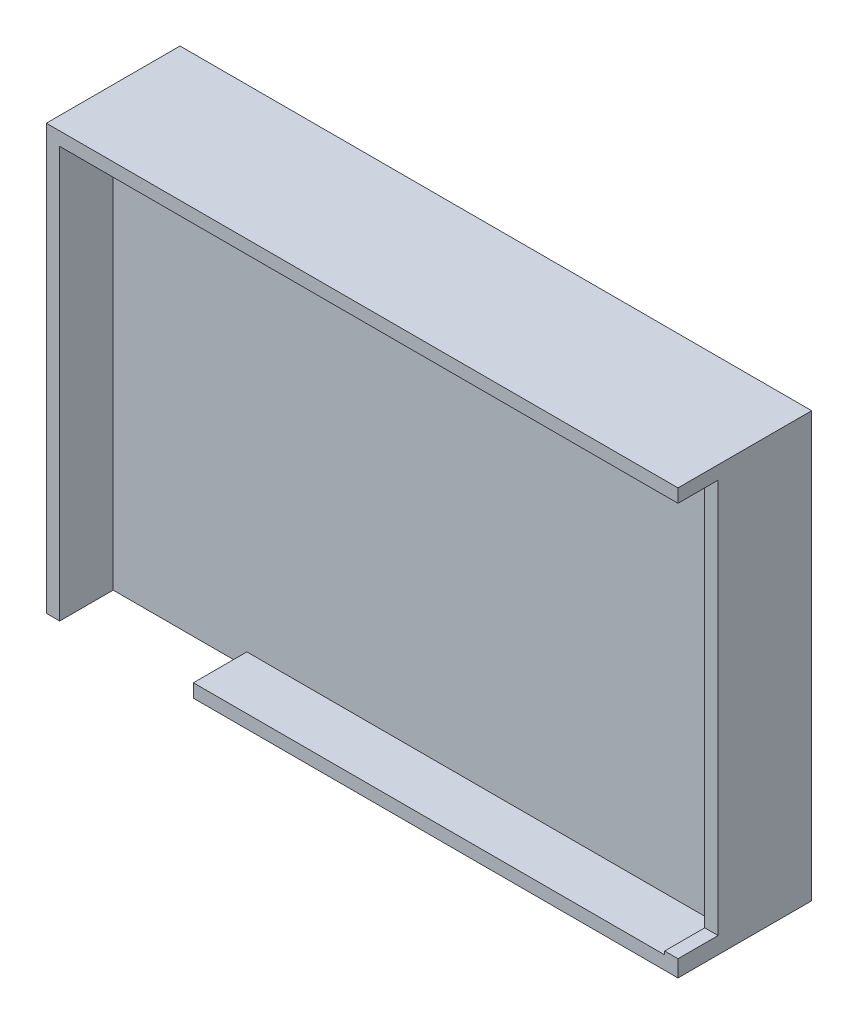
ISO-10303-21;
HEADER;
FILE_DESCRIPTION(('STEP AP214'),'2;1');
FILE_NAME('part.step','',(''),(''),'','','');
FILE_SCHEMA(('AUTOMOTIVE_DESIGN { 1 0 10303 214 1 1 1 1 }'));
ENDSEC;
DATA;
#1=APPLICATION_CONTEXT('core data for automotive mechanical design processes');
#2=APPLICATION_PROTOCOL_DEFINITION('international standard','automotive_design',2000,#1);
#3=PRODUCT_CONTEXT('',#1,'mechanical');
#4=PRODUCT('Part','Part','',(#3));
#5=PRODUCT_RELATED_PRODUCT_CATEGORY('part','',(#4));
#6=PRODUCT_DEFINITION_FORMATION('','',#4);
#7=PRODUCT_DEFINITION_CONTEXT('part definition',#1,'design');
#8=PRODUCT_DEFINITION('design','',#6,#7);
#9=PRODUCT_DEFINITION_SHAPE('','',#8);
#10=(LENGTH_UNIT() NAMED_UNIT(*) SI_UNIT(.MILLI.,.METRE.));
#11=(NAMED_UNIT(*) PLANE_ANGLE_UNIT() SI_UNIT($,.RADIAN.));
#12=(NAMED_UNIT(*) SI_UNIT($,.STERADIAN.) SOLID_ANGLE_UNIT());
#13=UNCERTAINTY_MEASURE_WITH_UNIT(LENGTH_MEASURE(1.E-05),#10,'distance_accuracy_value','');
#14=(GEOMETRIC_REPRESENTATION_CONTEXT(3) GLOBAL_UNCERTAINTY_ASSIGNED_CONTEXT((#13)) GLOBAL_UNIT_ASSIGNED_CONTEXT((#10,
#11,#12)) REPRESENTATION_CONTEXT('',''));
#15=CARTESIAN_POINT('',(0.,0.,0.));
#16=DIRECTION('',(0.,0.,1.));
#17=DIRECTION('',(1.,0.,0.));
#18=AXIS2_PLACEMENT_3D('',#15,#16,#17);
#19=CARTESIAN_POINT('',(0.,0.,10.));
#20=DIRECTION('',(0.,0.,1.));
#21=DIRECTION('',(1.,0.,0.));
#22=AXIS2_PLACEMENT_3D('',#19,#20,#21);
#23=PLANE('',#22);
#24=DIRECTION('',(-1.,0.,0.));
#25=VECTOR('',#24,1.);
#26=CARTESIAN_POINT('',(-45.25,29.75,10.));
#27=LINE('',#26,#25);
#28=CARTESIAN_POINT('',(47.25,29.75,10.));
#29=VERTEX_POINT('',#28);
#30=CARTESIAN_POINT('',(-45.25,29.75,10.));
#31=VERTEX_POINT('',#30);
#32=EDGE_CURVE('E287',#29,#31,#27,.T.);
#33=ORIENTED_EDGE('',*,*,#32,.F.);
#34=DIRECTION('',(0.,1.,0.));
#35=VECTOR('',#34,1.);
#36=CARTESIAN_POINT('',(47.25,-31.75,10.));
#37=LINE('',#36,#35);
#38=CARTESIAN_POINT('',(47.25,31.75,10.));
#39=VERTEX_POINT('',#38);
#40=EDGE_CURVE('E316',#29,#39,#37,.T.);
#41=ORIENTED_EDGE('',*,*,#40,.T.);
#42=DIRECTION('',(-1.,0.,0.));
#43=VECTOR('',#42,1.);
#44=CARTESIAN_POINT('',(47.25,31.75,10.));
#45=LINE('',#44,#43);
#46=CARTESIAN_POINT('',(-47.25,31.75,10.));
#47=VERTEX_POINT('',#46);
#48=EDGE_CURVE('E321',#39,#47,#45,.T.);
#49=ORIENTED_EDGE('',*,*,#48,.T.);
#50=DIRECTION('',(0.,-1.,0.));
#51=VECTOR('',#50,1.);
#52=CARTESIAN_POINT('',(-47.25,-31.75,10.));
#53=LINE('',#52,#51);
#54=CARTESIAN_POINT('',(-47.25,-31.75,10.));
#55=VERTEX_POINT('',#54);
#56=EDGE_CURVE('E307',#47,#55,#53,.T.);
#57=ORIENTED_EDGE('',*,*,#56,.T.);
#58=DIRECTION('',(1.,0.,0.));
#59=VECTOR('',#58,1.);
#60=CARTESIAN_POINT('',(47.25,-31.75,10.));
#61=LINE('',#60,#59);
#62=CARTESIAN_POINT('',(-45.25,-31.75,10.));
#63=VERTEX_POINT('',#62);
#64=EDGE_CURVE('E312',#55,#63,#61,.T.);
#65=ORIENTED_EDGE('',*,*,#64,.T.);
#66=DIRECTION('',(0.,-1.,0.));
#67=VECTOR('',#66,1.);
#68=CARTESIAN_POINT('',(-45.25,-29.75,10.));
#69=LINE('',#68,#67);
#70=EDGE_CURVE('E290',#31,#63,#69,.T.);
#71=ORIENTED_EDGE('',*,*,#70,.F.);
#72=EDGE_LOOP('',(#33,#41,#49,#57,#65,#71));
#73=FACE_BOUND('',#72,.T.);
#74=ADVANCED_FACE('F41',(#73),#23,.T.);
#75=CARTESIAN_POINT('',(45.25,-29.75,10.));
#76=DIRECTION('',(-1.,0.,0.));
#77=DIRECTION('',(0.,0.,1.));
#78=AXIS2_PLACEMENT_3D('',#75,#76,#77);
#79=PLANE('',#78);
#80=DIRECTION('',(0.,0.,1.));
#81=VECTOR('',#80,1.);
#82=CARTESIAN_POINT('',(45.25,-29.25,4.));
#83=LINE('',#82,#81);
#84=CARTESIAN_POINT('',(45.25,-29.25,4.));
#85=VERTEX_POINT('',#84);
#86=CARTESIAN_POINT('',(45.25,-29.25,10.));
#87=VERTEX_POINT('',#86);
#88=EDGE_CURVE('E161',#85,#87,#83,.T.);
#89=ORIENTED_EDGE('',*,*,#88,.F.);
#90=DIRECTION('',(0.,-1.,0.));
#91=VECTOR('',#90,1.);
#92=CARTESIAN_POINT('',(45.25,29.75,4.));
#93=LINE('',#92,#91);
#94=CARTESIAN_POINT('',(45.25,29.75,4.));
#95=VERTEX_POINT('',#94);
#96=EDGE_CURVE('E168',#95,#85,#93,.T.);
#97=ORIENTED_EDGE('',*,*,#96,.F.);
#98=DIRECTION('',(0.,0.,-1.));
#99=VECTOR('',#98,1.);
#100=CARTESIAN_POINT('',(45.25,29.75,10.));
#101=LINE('',#100,#99);
#102=CARTESIAN_POINT('',(45.25,29.75,2.));
#103=VERTEX_POINT('',#102);
#104=EDGE_CURVE('E304',#95,#103,#101,.T.);
#105=ORIENTED_EDGE('',*,*,#104,.T.);
#106=DIRECTION('',(0.,-1.,0.));
#107=VECTOR('',#106,1.);
#108=CARTESIAN_POINT('',(45.25,-29.75,2.));
#109=LINE('',#108,#107);
#110=CARTESIAN_POINT('',(45.25,-29.75,2.));
#111=VERTEX_POINT('',#110);
#112=EDGE_CURVE('E281',#103,#111,#109,.T.);
#113=ORIENTED_EDGE('',*,*,#112,.T.);
#114=DIRECTION('',(0.,0.,-1.));
#115=VECTOR('',#114,1.);
#116=CARTESIAN_POINT('',(45.25,-29.75,10.));
#117=LINE('',#116,#115);
#118=CARTESIAN_POINT('',(45.25,-29.75,10.));
#119=VERTEX_POINT('',#118);
#120=EDGE_CURVE('E296',#119,#111,#117,.T.);
#121=ORIENTED_EDGE('',*,*,#120,.F.);
#122=DIRECTION('',(0.,1.,0.));
#123=VECTOR('',#122,1.);
#124=CARTESIAN_POINT('',(45.25,-29.75,10.));
#125=LINE('',#124,#123);
#126=EDGE_CURVE('E183',#119,#87,#125,.T.);
#127=ORIENTED_EDGE('',*,*,#126,.T.);
#128=EDGE_LOOP('',(#89,#97,#105,#113,#121,#127));
#129=FACE_BOUND('',#128,.T.);
#130=ADVANCED_FACE('F180',(#129),#79,.T.);
#131=CARTESIAN_POINT('',(-45.25,29.75,10.));
#132=DIRECTION('',(0.,-1.,0.));
#133=DIRECTION('',(0.,0.,-1.));
#134=AXIS2_PLACEMENT_3D('',#131,#132,#133);
#135=PLANE('',#134);
#136=DIRECTION('',(0.,0.,-1.));
#137=VECTOR('',#136,1.);
#138=CARTESIAN_POINT('',(-45.25,29.75,10.));
#139=LINE('',#138,#137);
#140=CARTESIAN_POINT('',(-45.25,29.75,2.));
#141=VERTEX_POINT('',#140);
#142=EDGE_CURVE('E300',#31,#141,#139,.T.);
#143=ORIENTED_EDGE('',*,*,#142,.T.);
#144=DIRECTION('',(1.,0.,0.));
#145=VECTOR('',#144,1.);
#146=CARTESIAN_POINT('',(-45.25,29.75,2.));
#147=LINE('',#146,#145);
#148=EDGE_CURVE('E277',#141,#103,#147,.T.);
#149=ORIENTED_EDGE('',*,*,#148,.T.);
#150=ORIENTED_EDGE('',*,*,#104,.F.);
#151=DIRECTION('',(-1.,0.,0.));
#152=VECTOR('',#151,1.);
#153=CARTESIAN_POINT('',(45.25,29.75,4.));
#154=LINE('',#153,#152);
#155=CARTESIAN_POINT('',(47.25,29.75,4.));
#156=VERTEX_POINT('',#155);
#157=EDGE_CURVE('E173',#156,#95,#154,.T.);
#158=ORIENTED_EDGE('',*,*,#157,.F.);
#159=DIRECTION('',(0.,0.,1.));
#160=VECTOR('',#159,1.);
#161=CARTESIAN_POINT('',(47.25,29.75,4.));
#162=LINE('',#161,#160);
#163=EDGE_CURVE('E188',#156,#29,#162,.T.);
#164=ORIENTED_EDGE('',*,*,#163,.T.);
#165=ORIENTED_EDGE('',*,*,#32,.T.);
#166=EDGE_LOOP('',(#143,#149,#150,#158,#164,#165));
#167=FACE_BOUND('',#166,.T.);
#168=ADVANCED_FACE('F368',(#167),#135,.T.);
#169=CARTESIAN_POINT('',(-45.25,-29.75,10.));
#170=DIRECTION('',(1.,0.,0.));
#171=DIRECTION('',(0.,0.,-1.));
#172=AXIS2_PLACEMENT_3D('',#169,#170,#171);
#173=PLANE('',#172);
#174=ORIENTED_EDGE('',*,*,#70,.T.);
#175=DIRECTION('',(0.,0.,1.));
#176=VECTOR('',#175,1.);
#177=CARTESIAN_POINT('',(-45.25,-31.75,-18.0997512422418));
#178=LINE('',#177,#176);
#179=CARTESIAN_POINT('',(-45.25,-31.75,2.));
#180=VERTEX_POINT('',#179);
#181=EDGE_CURVE('E206',#180,#63,#178,.T.);
#182=ORIENTED_EDGE('',*,*,#181,.F.);
#183=DIRECTION('',(0.,1.,0.));
#184=VECTOR('',#183,1.);
#185=CARTESIAN_POINT('',(-45.25,-29.75,2.));
#186=LINE('',#185,#184);
#187=EDGE_CURVE('E273',#180,#141,#186,.T.);
#188=ORIENTED_EDGE('',*,*,#187,.T.);
#189=ORIENTED_EDGE('',*,*,#142,.F.);
#190=EDGE_LOOP('',(#174,#182,#188,#189));
#191=FACE_BOUND('',#190,.T.);
#192=ADVANCED_FACE('F373',(#191),#173,.T.);
#193=CARTESIAN_POINT('',(-45.25,-29.75,10.));
#194=DIRECTION('',(0.,1.,0.));
#195=DIRECTION('',(0.,0.,1.));
#196=AXIS2_PLACEMENT_3D('',#193,#194,#195);
#197=PLANE('',#196);
#198=DIRECTION('',(0.,0.,1.));
#199=VECTOR('',#198,1.);
#200=CARTESIAN_POINT('',(-25.25,-29.75,-18.0997512422418));
#201=LINE('',#200,#199);
#202=CARTESIAN_POINT('',(-25.25,-29.75,2.));
#203=VERTEX_POINT('',#202);
#204=CARTESIAN_POINT('',(-25.25,-29.75,10.));
#205=VERTEX_POINT('',#204);
#206=EDGE_CURVE('E202',#203,#205,#201,.T.);
#207=ORIENTED_EDGE('',*,*,#206,.T.);
#208=DIRECTION('',(1.,0.,0.));
#209=VECTOR('',#208,1.);
#210=CARTESIAN_POINT('',(-45.25,-29.75,10.));
#211=LINE('',#210,#209);
#212=EDGE_CURVE('E293',#205,#119,#211,.T.);
#213=ORIENTED_EDGE('',*,*,#212,.T.);
#214=ORIENTED_EDGE('',*,*,#120,.T.);
#215=DIRECTION('',(-1.,0.,0.));
#216=VECTOR('',#215,1.);
#217=CARTESIAN_POINT('',(-45.25,-29.75,2.));
#218=LINE('',#217,#216);
#219=EDGE_CURVE('E11',#111,#203,#218,.T.);
#220=ORIENTED_EDGE('',*,*,#219,.T.);
#221=EDGE_LOOP('',(#207,#213,#214,#220));
#222=FACE_BOUND('',#221,.T.);
#223=ADVANCED_FACE('F378',(#222),#197,.T.);
#224=DIRECTION('',(1.,0.,0.));
#225=VECTOR('',#224,1.);
#226=CARTESIAN_POINT('',(45.25,-29.25,10.));
#227=LINE('',#226,#225);
#228=CARTESIAN_POINT('',(47.25,-29.25,10.));
#229=VERTEX_POINT('',#228);
#230=EDGE_CURVE('E177',#87,#229,#227,.T.);
#231=ORIENTED_EDGE('',*,*,#230,.F.);
#232=ORIENTED_EDGE('',*,*,#126,.F.);
#233=ORIENTED_EDGE('',*,*,#212,.F.);
#234=DIRECTION('',(0.,1.,0.));
#235=VECTOR('',#234,1.);
#236=CARTESIAN_POINT('',(-25.25,-29.75,10.));
#237=LINE('',#236,#235);
#238=CARTESIAN_POINT('',(-25.25,-31.75,10.));
#239=VERTEX_POINT('',#238);
#240=EDGE_CURVE('E193',#239,#205,#237,.T.);
#241=ORIENTED_EDGE('',*,*,#240,.F.);
#242=CARTESIAN_POINT('',(47.25,-31.75,10.));
#243=VERTEX_POINT('',#242);
#244=EDGE_CURVE('E311',#239,#243,#61,.T.);
#245=ORIENTED_EDGE('',*,*,#244,.T.);
#246=EDGE_CURVE('E317',#243,#229,#37,.T.);
#247=ORIENTED_EDGE('',*,*,#246,.T.);
#248=EDGE_LOOP('',(#231,#232,#233,#241,#245,#247));
#249=FACE_BOUND('',#248,.T.);
#250=ADVANCED_FACE('F380',(#249),#23,.T.);
#251=CARTESIAN_POINT('',(-47.25,-31.75,10.));
#252=DIRECTION('',(1.,0.,0.));
#253=DIRECTION('',(0.,0.,-1.));
#254=AXIS2_PLACEMENT_3D('',#251,#252,#253);
#255=PLANE('',#254);
#256=DIRECTION('',(0.,0.,-1.));
#257=VECTOR('',#256,1.);
#258=CARTESIAN_POINT('',(-47.25,31.75,10.));
#259=LINE('',#258,#257);
#260=CARTESIAN_POINT('',(-47.25,31.75,-10.));
#261=VERTEX_POINT('',#260);
#262=EDGE_CURVE('E324',#47,#261,#259,.T.);
#263=ORIENTED_EDGE('',*,*,#262,.T.);
#264=DIRECTION('',(0.,1.,0.));
#265=VECTOR('',#264,1.);
#266=CARTESIAN_POINT('',(-47.25,0.,-10.));
#267=LINE('',#266,#265);
#268=CARTESIAN_POINT('',(-47.25,-31.75,-10.));
#269=VERTEX_POINT('',#268);
#270=EDGE_CURVE('E217',#269,#261,#267,.T.);
#271=ORIENTED_EDGE('',*,*,#270,.F.);
#272=DIRECTION('',(0.,0.,-1.));
#273=VECTOR('',#272,1.);
#274=CARTESIAN_POINT('',(-47.25,-31.75,10.));
#275=LINE('',#274,#273);
#276=EDGE_CURVE('E50',#55,#269,#275,.T.);
#277=ORIENTED_EDGE('',*,*,#276,.F.);
#278=ORIENTED_EDGE('',*,*,#56,.F.);
#279=EDGE_LOOP('',(#263,#271,#277,#278));
#280=FACE_BOUND('',#279,.T.);
#281=ADVANCED_FACE('F43',(#280),#255,.F.);
#282=CARTESIAN_POINT('',(47.25,-31.75,10.));
#283=DIRECTION('',(0.,1.,0.));
#284=DIRECTION('',(-1.,0.,0.));
#285=AXIS2_PLACEMENT_3D('',#282,#283,#284);
#286=PLANE('',#285);
#287=ORIENTED_EDGE('',*,*,#244,.F.);
#288=DIRECTION('',(0.,0.,1.));
#289=VECTOR('',#288,1.);
#290=CARTESIAN_POINT('',(-25.25,-31.75,-18.0997512422418));
#291=LINE('',#290,#289);
#292=CARTESIAN_POINT('',(-25.25,-31.75,1.99999999999999));
#293=VERTEX_POINT('',#292);
#294=EDGE_CURVE('E199',#293,#239,#291,.T.);
#295=ORIENTED_EDGE('',*,*,#294,.F.);
#296=DIRECTION('',(1.,0.,0.));
#297=VECTOR('',#296,1.);
#298=CARTESIAN_POINT('',(-45.25,-31.75,2.));
#299=LINE('',#298,#297);
#300=EDGE_CURVE('E196',#180,#293,#299,.T.);
#301=ORIENTED_EDGE('',*,*,#300,.F.);
#302=ORIENTED_EDGE('',*,*,#181,.T.);
#303=ORIENTED_EDGE('',*,*,#64,.F.);
#304=ORIENTED_EDGE('',*,*,#276,.T.);
#305=DIRECTION('',(-1.,0.,0.));
#306=VECTOR('',#305,1.);
#307=CARTESIAN_POINT('',(0.,-31.75,-10.));
#308=LINE('',#307,#306);
#309=CARTESIAN_POINT('',(47.25,-31.75,-10.));
#310=VERTEX_POINT('',#309);
#311=EDGE_CURVE('E213',#310,#269,#308,.T.);
#312=ORIENTED_EDGE('',*,*,#311,.F.);
#313=DIRECTION('',(0.,0.,-1.));
#314=VECTOR('',#313,1.);
#315=CARTESIAN_POINT('',(47.25,-31.75,10.));
#316=LINE('',#315,#314);
#317=EDGE_CURVE('E330',#243,#310,#316,.T.);
#318=ORIENTED_EDGE('',*,*,#317,.F.);
#319=EDGE_LOOP('',(#287,#295,#301,#302,#303,#304,#312,#318));
#320=FACE_BOUND('',#319,.T.);
#321=ADVANCED_FACE('F338',(#320),#286,.F.);
#322=CARTESIAN_POINT('',(47.25,-31.75,10.));
#323=DIRECTION('',(-1.,0.,0.));
#324=DIRECTION('',(0.,-1.,0.));
#325=AXIS2_PLACEMENT_3D('',#322,#323,#324);
#326=PLANE('',#325);
#327=ORIENTED_EDGE('',*,*,#40,.F.);
#328=ORIENTED_EDGE('',*,*,#163,.F.);
#329=DIRECTION('',(0.,1.,0.));
#330=VECTOR('',#329,1.);
#331=CARTESIAN_POINT('',(47.25,29.75,4.));
#332=LINE('',#331,#330);
#333=CARTESIAN_POINT('',(47.25,-29.25,4.));
#334=VERTEX_POINT('',#333);
#335=EDGE_CURVE('E167',#334,#156,#332,.T.);
#336=ORIENTED_EDGE('',*,*,#335,.F.);
#337=DIRECTION('',(0.,0.,1.));
#338=VECTOR('',#337,1.);
#339=CARTESIAN_POINT('',(47.25,-29.25,4.));
#340=LINE('',#339,#338);
#341=EDGE_CURVE('E164',#334,#229,#340,.T.);
#342=ORIENTED_EDGE('',*,*,#341,.T.);
#343=ORIENTED_EDGE('',*,*,#246,.F.);
#344=ORIENTED_EDGE('',*,*,#317,.T.);
#345=DIRECTION('',(0.,-1.,0.));
#346=VECTOR('',#345,1.);
#347=CARTESIAN_POINT('',(47.25,0.,-10.));
#348=LINE('',#347,#346);
#349=CARTESIAN_POINT('',(47.25,31.75,-10.));
#350=VERTEX_POINT('',#349);
#351=EDGE_CURVE('E226',#350,#310,#348,.T.);
#352=ORIENTED_EDGE('',*,*,#351,.F.);
#353=DIRECTION('',(0.,0.,-1.));
#354=VECTOR('',#353,1.);
#355=CARTESIAN_POINT('',(47.25,31.75,10.));
#356=LINE('',#355,#354);
#357=EDGE_CURVE('E327',#39,#350,#356,.T.);
#358=ORIENTED_EDGE('',*,*,#357,.F.);
#359=EDGE_LOOP('',(#327,#328,#336,#342,#343,#344,#352,#358));
#360=FACE_BOUND('',#359,.T.);
#361=ADVANCED_FACE('F351',(#360),#326,.F.);
#362=CARTESIAN_POINT('',(47.25,31.75,10.));
#363=DIRECTION('',(0.,-1.,0.));
#364=DIRECTION('',(1.,0.,0.));
#365=AXIS2_PLACEMENT_3D('',#362,#363,#364);
#366=PLANE('',#365);
#367=ORIENTED_EDGE('',*,*,#357,.T.);
#368=DIRECTION('',(1.,0.,0.));
#369=VECTOR('',#368,1.);
#370=CARTESIAN_POINT('',(0.,31.75,-10.));
#371=LINE('',#370,#369);
#372=EDGE_CURVE('E222',#261,#350,#371,.T.);
#373=ORIENTED_EDGE('',*,*,#372,.F.);
#374=ORIENTED_EDGE('',*,*,#262,.F.);
#375=ORIENTED_EDGE('',*,*,#48,.F.);
#376=EDGE_LOOP('',(#367,#373,#374,#375));
#377=FACE_BOUND('',#376,.T.);
#378=ADVANCED_FACE('F452',(#377),#366,.F.);
#379=CARTESIAN_POINT('',(0.,0.,2.));
#380=DIRECTION('',(0.,0.,-1.));
#381=DIRECTION('',(-1.,0.,0.));
#382=AXIS2_PLACEMENT_3D('',#379,#380,#381);
#383=PLANE('',#382);
#384=ORIENTED_EDGE('',*,*,#112,.F.);
#385=ORIENTED_EDGE('',*,*,#148,.F.);
#386=ORIENTED_EDGE('',*,*,#187,.F.);
#387=ORIENTED_EDGE('',*,*,#300,.T.);
#388=DIRECTION('',(0.,1.,0.));
#389=VECTOR('',#388,1.);
#390=CARTESIAN_POINT('',(-25.25,-29.75,2.));
#391=LINE('',#390,#389);
#392=EDGE_CURVE('E65',#293,#203,#391,.T.);
#393=ORIENTED_EDGE('',*,*,#392,.T.);
#394=ORIENTED_EDGE('',*,*,#219,.F.);
#395=EDGE_LOOP('',(#384,#385,#386,#387,#393,#394));
#396=FACE_BOUND('',#395,.T.);
#397=ADVANCED_FACE('F376',(#396),#383,.F.);
#398=CARTESIAN_POINT('',(0.,-1.65000000000001,-10.));
#399=DIRECTION('',(0.,-1.,0.));
#400=DIRECTION('',(1.,0.,0.));
#401=AXIS2_PLACEMENT_3D('',#398,#399,#400);
#402=PLANE('',#401);
#403=DIRECTION('',(1.,0.,0.));
#404=VECTOR('',#403,1.);
#405=CARTESIAN_POINT('',(0.,-1.65000000000001,0.));
#406=LINE('',#405,#404);
#407=CARTESIAN_POINT('',(-38.,-1.65,0.));
#408=VERTEX_POINT('',#407);
#409=CARTESIAN_POINT('',(38.,-1.65000000000001,0.));
#410=VERTEX_POINT('',#409);
#411=EDGE_CURVE('E212',#408,#410,#406,.T.);
#412=ORIENTED_EDGE('',*,*,#411,.T.);
#413=DIRECTION('',(0.,0.,1.));
#414=VECTOR('',#413,1.);
#415=CARTESIAN_POINT('',(38.,-1.65000000000001,-10.));
#416=LINE('',#415,#414);
#417=CARTESIAN_POINT('',(38.,-1.65000000000001,-10.));
#418=VERTEX_POINT('',#417);
#419=EDGE_CURVE('E269',#418,#410,#416,.T.);
#420=ORIENTED_EDGE('',*,*,#419,.F.);
#421=DIRECTION('',(1.,0.,0.));
#422=VECTOR('',#421,1.);
#423=CARTESIAN_POINT('',(0.,-1.65000000000001,-10.));
#424=LINE('',#423,#422);
#425=CARTESIAN_POINT('',(-38.,-1.65,-10.));
#426=VERTEX_POINT('',#425);
#427=EDGE_CURVE('E230',#426,#418,#424,.T.);
#428=ORIENTED_EDGE('',*,*,#427,.F.);
#429=DIRECTION('',(0.,0.,1.));
#430=VECTOR('',#429,1.);
#431=CARTESIAN_POINT('',(-38.,-1.65,-10.));
#432=LINE('',#431,#430);
#433=EDGE_CURVE('E245',#426,#408,#432,.T.);
#434=ORIENTED_EDGE('',*,*,#433,.T.);
#435=EDGE_LOOP('',(#412,#420,#428,#434));
#436=FACE_BOUND('',#435,.T.);
#437=ADVANCED_FACE('F451',(#436),#402,.F.);
#438=CARTESIAN_POINT('',(38.,0.,-10.));
#439=DIRECTION('',(1.,0.,0.));
#440=DIRECTION('',(0.,0.,-1.));
#441=AXIS2_PLACEMENT_3D('',#438,#439,#440);
#442=PLANE('',#441);
#443=DIRECTION('',(0.,1.,0.));
#444=VECTOR('',#443,1.);
#445=CARTESIAN_POINT('',(38.,0.,0.));
#446=LINE('',#445,#444);
#447=CARTESIAN_POINT('',(38.,1.65,0.));
#448=VERTEX_POINT('',#447);
#449=EDGE_CURVE('E249',#410,#448,#446,.T.);
#450=ORIENTED_EDGE('',*,*,#449,.T.);
#451=DIRECTION('',(0.,0.,1.));
#452=VECTOR('',#451,1.);
#453=CARTESIAN_POINT('',(38.,1.65,-10.));
#454=LINE('',#453,#452);
#455=CARTESIAN_POINT('',(38.,1.65,-10.));
#456=VERTEX_POINT('',#455);
#457=EDGE_CURVE('E265',#456,#448,#454,.T.);
#458=ORIENTED_EDGE('',*,*,#457,.F.);
#459=DIRECTION('',(0.,1.,0.));
#460=VECTOR('',#459,1.);
#461=CARTESIAN_POINT('',(38.,0.,-10.));
#462=LINE('',#461,#460);
#463=EDGE_CURVE('E234',#418,#456,#462,.T.);
#464=ORIENTED_EDGE('',*,*,#463,.F.);
#465=ORIENTED_EDGE('',*,*,#419,.T.);
#466=EDGE_LOOP('',(#450,#458,#464,#465));
#467=FACE_BOUND('',#466,.T.);
#468=ADVANCED_FACE('F549',(#467),#442,.F.);
#469=CARTESIAN_POINT('',(0.,1.65,-10.));
#470=DIRECTION('',(0.,-1.,0.));
#471=DIRECTION('',(1.,0.,0.));
#472=AXIS2_PLACEMENT_3D('',#469,#470,#471);
#473=PLANE('',#472);
#474=DIRECTION('',(1.,0.,0.));
#475=VECTOR('',#474,1.);
#476=CARTESIAN_POINT('',(0.,1.65,0.));
#477=LINE('',#476,#475);
#478=CARTESIAN_POINT('',(-38.,1.65000000000001,0.));
#479=VERTEX_POINT('',#478);
#480=EDGE_CURVE('E253',#479,#448,#477,.T.);
#481=ORIENTED_EDGE('',*,*,#480,.F.);
#482=DIRECTION('',(0.,0.,1.));
#483=VECTOR('',#482,1.);
#484=CARTESIAN_POINT('',(-38.,1.65000000000001,-10.));
#485=LINE('',#484,#483);
#486=CARTESIAN_POINT('',(-38.,1.65000000000001,-10.));
#487=VERTEX_POINT('',#486);
#488=EDGE_CURVE('E261',#487,#479,#485,.T.);
#489=ORIENTED_EDGE('',*,*,#488,.F.);
#490=DIRECTION('',(1.,0.,0.));
#491=VECTOR('',#490,1.);
#492=CARTESIAN_POINT('',(0.,1.65,-10.));
#493=LINE('',#492,#491);
#494=EDGE_CURVE('E237',#487,#456,#493,.T.);
#495=ORIENTED_EDGE('',*,*,#494,.T.);
#496=ORIENTED_EDGE('',*,*,#457,.T.);
#497=EDGE_LOOP('',(#481,#489,#495,#496));
#498=FACE_BOUND('',#497,.T.);
#499=ADVANCED_FACE('F558',(#498),#473,.T.);
#500=CARTESIAN_POINT('',(-38.,0.,-10.));
#501=DIRECTION('',(1.,0.,0.));
#502=DIRECTION('',(0.,0.,-1.));
#503=AXIS2_PLACEMENT_3D('',#500,#501,#502);
#504=PLANE('',#503);
#505=DIRECTION('',(0.,1.,0.));
#506=VECTOR('',#505,1.);
#507=CARTESIAN_POINT('',(-38.,0.,0.));
#508=LINE('',#507,#506);
#509=EDGE_CURVE('E218',#408,#479,#508,.T.);
#510=ORIENTED_EDGE('',*,*,#509,.F.);
#511=ORIENTED_EDGE('',*,*,#433,.F.);
#512=DIRECTION('',(0.,1.,0.));
#513=VECTOR('',#512,1.);
#514=CARTESIAN_POINT('',(-38.,0.,-10.));
#515=LINE('',#514,#513);
#516=EDGE_CURVE('E241',#426,#487,#515,.T.);
#517=ORIENTED_EDGE('',*,*,#516,.T.);
#518=ORIENTED_EDGE('',*,*,#488,.T.);
#519=EDGE_LOOP('',(#510,#511,#517,#518));
#520=FACE_BOUND('',#519,.T.);
#521=ADVANCED_FACE('F568',(#520),#504,.T.);
#522=CARTESIAN_POINT('',(0.,0.,-10.));
#523=DIRECTION('',(0.,0.,-1.));
#524=DIRECTION('',(-1.,0.,0.));
#525=AXIS2_PLACEMENT_3D('',#522,#523,#524);
#526=PLANE('',#525);
#527=ORIENTED_EDGE('',*,*,#311,.T.);
#528=ORIENTED_EDGE('',*,*,#270,.T.);
#529=ORIENTED_EDGE('',*,*,#372,.T.);
#530=ORIENTED_EDGE('',*,*,#351,.T.);
#531=EDGE_LOOP('',(#527,#528,#529,#530));
#532=FACE_BOUND('',#531,.T.);
#533=ORIENTED_EDGE('',*,*,#427,.T.);
#534=ORIENTED_EDGE('',*,*,#463,.T.);
#535=ORIENTED_EDGE('',*,*,#494,.F.);
#536=ORIENTED_EDGE('',*,*,#516,.F.);
#537=EDGE_LOOP('',(#533,#534,#535,#536));
#538=FACE_BOUND('',#537,.T.);
#539=ADVANCED_FACE('F345',(#532,#538),#526,.T.);
#540=CARTESIAN_POINT('',(0.,0.,0.));
#541=DIRECTION('',(0.,0.,1.));
#542=DIRECTION('',(1.,0.,0.));
#543=AXIS2_PLACEMENT_3D('',#540,#541,#542);
#544=PLANE('',#543);
#545=ORIENTED_EDGE('',*,*,#411,.F.);
#546=ORIENTED_EDGE('',*,*,#509,.T.);
#547=ORIENTED_EDGE('',*,*,#480,.T.);
#548=ORIENTED_EDGE('',*,*,#449,.F.);
#549=EDGE_LOOP('',(#545,#546,#547,#548));
#550=FACE_BOUND('',#549,.T.);
#551=ADVANCED_FACE('F384',(#550),#544,.F.);
#552=CARTESIAN_POINT('',(-25.25,-29.75,-18.0997512422418));
#553=DIRECTION('',(1.,0.,0.));
#554=DIRECTION('',(0.,0.,-1.));
#555=AXIS2_PLACEMENT_3D('',#552,#553,#554);
#556=PLANE('',#555);
#557=ORIENTED_EDGE('',*,*,#294,.T.);
#558=ORIENTED_EDGE('',*,*,#240,.T.);
#559=ORIENTED_EDGE('',*,*,#206,.F.);
#560=ORIENTED_EDGE('',*,*,#392,.F.);
#561=EDGE_LOOP('',(#557,#558,#559,#560));
#562=FACE_BOUND('',#561,.T.);
#563=ADVANCED_FACE('F382',(#562),#556,.F.);
#564=CARTESIAN_POINT('',(45.25,-29.25,4.));
#565=DIRECTION('',(0.,-1.,0.));
#566=DIRECTION('',(0.,0.,-1.));
#567=AXIS2_PLACEMENT_3D('',#564,#565,#566);
#568=PLANE('',#567);
#569=ORIENTED_EDGE('',*,*,#230,.T.);
#570=ORIENTED_EDGE('',*,*,#341,.F.);
#571=DIRECTION('',(1.,0.,0.));
#572=VECTOR('',#571,1.);
#573=CARTESIAN_POINT('',(45.25,-29.25,4.));
#574=LINE('',#573,#572);
#575=EDGE_CURVE('E57',#85,#334,#574,.T.);
#576=ORIENTED_EDGE('',*,*,#575,.F.);
#577=ORIENTED_EDGE('',*,*,#88,.T.);
#578=EDGE_LOOP('',(#569,#570,#576,#577));
#579=FACE_BOUND('',#578,.T.);
#580=ADVANCED_FACE('F159',(#579),#568,.F.);
#581=CARTESIAN_POINT('',(0.,0.,4.));
#582=DIRECTION('',(0.,0.,1.));
#583=DIRECTION('',(1.,0.,0.));
#584=AXIS2_PLACEMENT_3D('',#581,#582,#583);
#585=PLANE('',#584);
#586=ORIENTED_EDGE('',*,*,#96,.T.);
#587=ORIENTED_EDGE('',*,*,#575,.T.);
#588=ORIENTED_EDGE('',*,*,#335,.T.);
#589=ORIENTED_EDGE('',*,*,#157,.T.);
#590=EDGE_LOOP('',(#586,#587,#588,#589));
#591=FACE_BOUND('',#590,.T.);
#592=ADVANCED_FACE('F171',(#591),#585,.T.);
#593=CLOSED_SHELL('',(#74,#130,#168,#192,#223,#250,#281,#321,#361,#378,#397,#437,#468,#499,#521,
#539,#551,#563,#580,#592));
#594=MANIFOLD_SOLID_BREP('B2',#593);
#595=ADVANCED_BREP_SHAPE_REPRESENTATION('',(#18,#594),#14);
#596=SHAPE_DEFINITION_REPRESENTATION(#9,#595);
ENDSEC;
END-ISO-10303-21;
